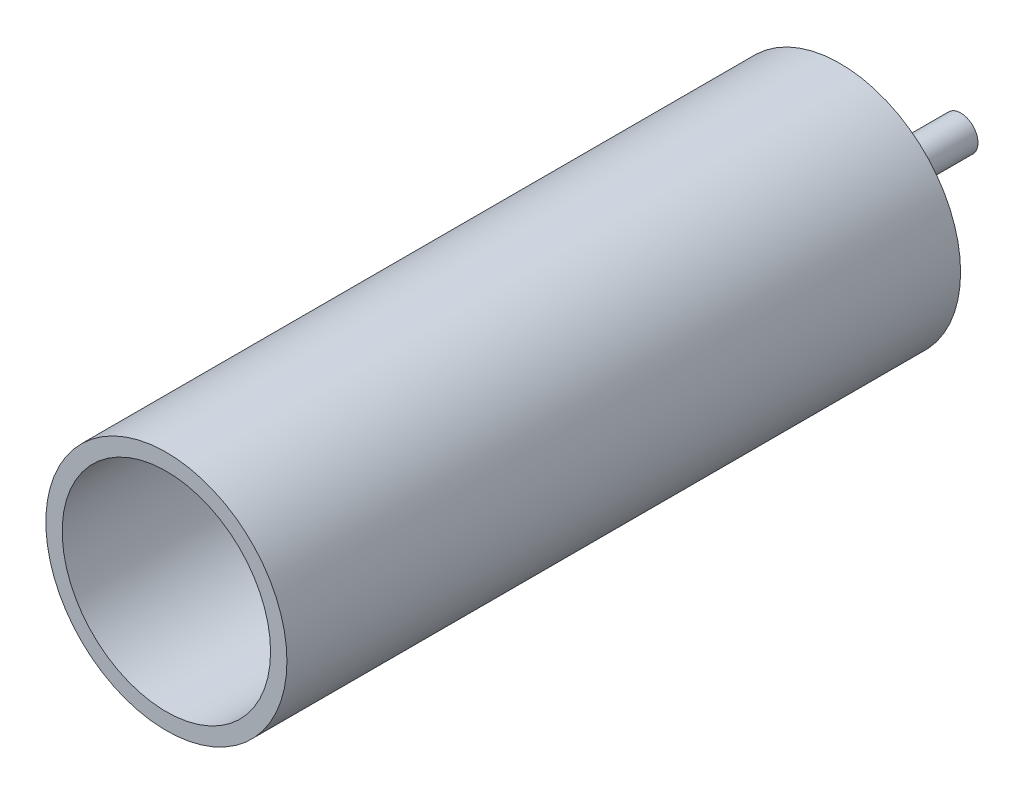
ISO-10303-21;
HEADER;
FILE_DESCRIPTION(('STEP AP214'),'2;1');
FILE_NAME('part.step','',(''),(''),'','','');
FILE_SCHEMA(('AUTOMOTIVE_DESIGN { 1 0 10303 214 1 1 1 1 }'));
ENDSEC;
DATA;
#1=APPLICATION_CONTEXT('core data for automotive mechanical design processes');
#2=APPLICATION_PROTOCOL_DEFINITION('international standard','automotive_design',2000,#1);
#3=PRODUCT_CONTEXT('',#1,'mechanical');
#4=PRODUCT('Part','Part','',(#3));
#5=PRODUCT_RELATED_PRODUCT_CATEGORY('part','',(#4));
#6=PRODUCT_DEFINITION_FORMATION('','',#4);
#7=PRODUCT_DEFINITION_CONTEXT('part definition',#1,'design');
#8=PRODUCT_DEFINITION('design','',#6,#7);
#9=PRODUCT_DEFINITION_SHAPE('','',#8);
#10=(LENGTH_UNIT() NAMED_UNIT(*) SI_UNIT(.MILLI.,.METRE.));
#11=(NAMED_UNIT(*) PLANE_ANGLE_UNIT() SI_UNIT($,.RADIAN.));
#12=(NAMED_UNIT(*) SI_UNIT($,.STERADIAN.) SOLID_ANGLE_UNIT());
#13=UNCERTAINTY_MEASURE_WITH_UNIT(LENGTH_MEASURE(1.E-05),#10,'distance_accuracy_value','');
#14=(GEOMETRIC_REPRESENTATION_CONTEXT(3) GLOBAL_UNCERTAINTY_ASSIGNED_CONTEXT((#13)) GLOBAL_UNIT_ASSIGNED_CONTEXT((#10,
#11,#12)) REPRESENTATION_CONTEXT('',''));
#15=CARTESIAN_POINT('',(0.,0.,0.));
#16=DIRECTION('',(0.,0.,1.));
#17=DIRECTION('',(1.,0.,0.));
#18=AXIS2_PLACEMENT_3D('',#15,#16,#17);
#19=CARTESIAN_POINT('',(0.,0.,-195.58));
#20=DIRECTION('',(0.,0.,1.));
#21=DIRECTION('',(1.,0.,0.));
#22=AXIS2_PLACEMENT_3D('',#19,#20,#21);
#23=CYLINDRICAL_SURFACE('',#22,35.);
#24=CARTESIAN_POINT('',(0.,0.,-195.58));
#25=DIRECTION('',(0.,0.,1.));
#26=DIRECTION('',(1.,0.,0.));
#27=AXIS2_PLACEMENT_3D('',#24,#25,#26);
#28=CIRCLE('',#27,35.);
#29=CARTESIAN_POINT('',(35.,0.,-195.58));
#30=VERTEX_POINT('',#29);
#31=EDGE_CURVE('E41',#30,#30,#28,.T.);
#32=ORIENTED_EDGE('',*,*,#31,.T.);
#33=EDGE_LOOP('',(#32));
#34=FACE_BOUND('',#33,.T.);
#35=CARTESIAN_POINT('',(0.,0.,0.));
#36=DIRECTION('',(0.,0.,1.));
#37=DIRECTION('',(1.,0.,0.));
#38=AXIS2_PLACEMENT_3D('',#35,#36,#37);
#39=CIRCLE('',#38,35.);
#40=CARTESIAN_POINT('',(35.,0.,0.));
#41=VERTEX_POINT('',#40);
#42=EDGE_CURVE('E46',#41,#41,#39,.T.);
#43=ORIENTED_EDGE('',*,*,#42,.F.);
#44=EDGE_LOOP('',(#43));
#45=FACE_BOUND('',#44,.T.);
#46=ADVANCED_FACE('F35',(#34,#45),#23,.T.);
#47=CARTESIAN_POINT('',(0.,0.,-195.58));
#48=DIRECTION('',(0.,0.,1.));
#49=DIRECTION('',(1.,0.,0.));
#50=AXIS2_PLACEMENT_3D('',#47,#48,#49);
#51=PLANE('',#50);
#52=CARTESIAN_POINT('',(0.,0.,-195.58));
#53=DIRECTION('',(0.,0.,1.));
#54=DIRECTION('',(1.,0.,0.));
#55=AXIS2_PLACEMENT_3D('',#52,#53,#54);
#56=CIRCLE('',#55,5.);
#57=CARTESIAN_POINT('',(5.,0.,-195.58));
#58=VERTEX_POINT('',#57);
#59=EDGE_CURVE('E10',#58,#58,#56,.F.);
#60=ORIENTED_EDGE('',*,*,#59,.F.);
#61=EDGE_LOOP('',(#60));
#62=FACE_BOUND('',#61,.T.);
#63=ORIENTED_EDGE('',*,*,#31,.F.);
#64=EDGE_LOOP('',(#63));
#65=FACE_BOUND('',#64,.T.);
#66=ADVANCED_FACE('F76',(#62,#65),#51,.F.);
#67=CARTESIAN_POINT('',(0.,0.,0.));
#68=DIRECTION('',(0.,0.,1.));
#69=DIRECTION('',(1.,0.,0.));
#70=AXIS2_PLACEMENT_3D('',#67,#68,#69);
#71=PLANE('',#70);
#72=CARTESIAN_POINT('',(0.,0.,0.));
#73=DIRECTION('',(0.,0.,1.));
#74=DIRECTION('',(1.,0.,0.));
#75=AXIS2_PLACEMENT_3D('',#72,#73,#74);
#76=CIRCLE('',#75,30.25);
#77=CARTESIAN_POINT('',(30.25,0.,0.));
#78=VERTEX_POINT('',#77);
#79=EDGE_CURVE('E57',#78,#78,#76,.T.);
#80=ORIENTED_EDGE('',*,*,#79,.F.);
#81=EDGE_LOOP('',(#80));
#82=FACE_BOUND('',#81,.T.);
#83=ORIENTED_EDGE('',*,*,#42,.T.);
#84=EDGE_LOOP('',(#83));
#85=FACE_BOUND('',#84,.T.);
#86=ADVANCED_FACE('F72',(#82,#85),#71,.T.);
#87=CARTESIAN_POINT('',(0.,0.,-230.632));
#88=DIRECTION('',(0.,0.,1.));
#89=DIRECTION('',(1.,0.,0.));
#90=AXIS2_PLACEMENT_3D('',#87,#88,#89);
#91=CYLINDRICAL_SURFACE('',#90,5.);
#92=CARTESIAN_POINT('',(0.,0.,-230.632));
#93=DIRECTION('',(0.,0.,-1.));
#94=DIRECTION('',(-1.,0.,0.));
#95=AXIS2_PLACEMENT_3D('',#92,#93,#94);
#96=CIRCLE('',#95,5.);
#97=CARTESIAN_POINT('',(-5.,0.,-230.632));
#98=VERTEX_POINT('',#97);
#99=EDGE_CURVE('E52',#98,#98,#96,.T.);
#100=ORIENTED_EDGE('',*,*,#99,.F.);
#101=EDGE_LOOP('',(#100));
#102=FACE_BOUND('',#101,.T.);
#103=ORIENTED_EDGE('',*,*,#59,.T.);
#104=EDGE_LOOP('',(#103));
#105=FACE_BOUND('',#104,.T.);
#106=ADVANCED_FACE('F75',(#102,#105),#91,.T.);
#107=CARTESIAN_POINT('',(0.,0.,-230.632));
#108=DIRECTION('',(0.,0.,-1.));
#109=DIRECTION('',(-1.,0.,0.));
#110=AXIS2_PLACEMENT_3D('',#107,#108,#109);
#111=PLANE('',#110);
#112=ORIENTED_EDGE('',*,*,#99,.T.);
#113=EDGE_LOOP('',(#112));
#114=FACE_BOUND('',#113,.T.);
#115=ADVANCED_FACE('F68',(#114),#111,.T.);
#116=CARTESIAN_POINT('',(0.,0.,-152.4));
#117=DIRECTION('',(0.,0.,1.));
#118=DIRECTION('',(1.,0.,0.));
#119=AXIS2_PLACEMENT_3D('',#116,#117,#118);
#120=CYLINDRICAL_SURFACE('',#119,30.25);
#121=CARTESIAN_POINT('',(0.,0.,-152.4));
#122=DIRECTION('',(0.,0.,1.));
#123=DIRECTION('',(1.,0.,0.));
#124=AXIS2_PLACEMENT_3D('',#121,#122,#123);
#125=CIRCLE('',#124,30.25);
#126=CARTESIAN_POINT('',(30.25,0.,-152.4));
#127=VERTEX_POINT('',#126);
#128=EDGE_CURVE('E56',#127,#127,#125,.T.);
#129=CARTESIAN_POINT('',(30.25,0.,-152.4));
#130=CARTESIAN_POINT('',(30.25,0.,-150.8125));
#131=CARTESIAN_POINT('',(30.25,0.,-149.225));
#132=CARTESIAN_POINT('',(30.25,0.,-146.05));
#133=CARTESIAN_POINT('',(30.25,0.,-144.4625));
#134=CARTESIAN_POINT('',(30.25,0.,-141.2875));
#135=CARTESIAN_POINT('',(30.25,0.,-139.7));
#136=CARTESIAN_POINT('',(30.25,0.,-136.525));
#137=CARTESIAN_POINT('',(30.25,0.,-134.9375));
#138=CARTESIAN_POINT('',(30.25,0.,-131.7625));
#139=CARTESIAN_POINT('',(30.25,0.,-130.175));
#140=CARTESIAN_POINT('',(30.25,0.,-127.));
#141=CARTESIAN_POINT('',(30.25,0.,-125.4125));
#142=CARTESIAN_POINT('',(30.25,0.,-122.2375));
#143=CARTESIAN_POINT('',(30.25,0.,-120.65));
#144=CARTESIAN_POINT('',(30.25,0.,-117.475));
#145=CARTESIAN_POINT('',(30.25,0.,-115.8875));
#146=CARTESIAN_POINT('',(30.25,0.,-112.7125));
#147=CARTESIAN_POINT('',(30.25,0.,-111.125));
#148=CARTESIAN_POINT('',(30.25,0.,-107.95));
#149=CARTESIAN_POINT('',(30.25,0.,-106.3625));
#150=CARTESIAN_POINT('',(30.25,0.,-103.1875));
#151=CARTESIAN_POINT('',(30.25,0.,-101.6));
#152=CARTESIAN_POINT('',(30.25,0.,-98.425));
#153=CARTESIAN_POINT('',(30.25,0.,-96.8375));
#154=CARTESIAN_POINT('',(30.25,0.,-93.6625));
#155=CARTESIAN_POINT('',(30.25,0.,-92.075));
#156=CARTESIAN_POINT('',(30.25,0.,-88.9));
#157=CARTESIAN_POINT('',(30.25,0.,-87.3125));
#158=CARTESIAN_POINT('',(30.25,0.,-84.1375));
#159=CARTESIAN_POINT('',(30.25,0.,-82.55));
#160=CARTESIAN_POINT('',(30.25,0.,-79.375));
#161=CARTESIAN_POINT('',(30.25,0.,-77.7875));
#162=CARTESIAN_POINT('',(30.25,0.,-74.6125));
#163=CARTESIAN_POINT('',(30.25,0.,-73.025));
#164=CARTESIAN_POINT('',(30.25,0.,-69.85));
#165=CARTESIAN_POINT('',(30.25,0.,-68.2625));
#166=CARTESIAN_POINT('',(30.25,0.,-65.0875));
#167=CARTESIAN_POINT('',(30.25,0.,-63.5));
#168=CARTESIAN_POINT('',(30.25,0.,-60.325));
#169=CARTESIAN_POINT('',(30.25,0.,-58.7375));
#170=CARTESIAN_POINT('',(30.25,0.,-55.5625));
#171=CARTESIAN_POINT('',(30.25,0.,-53.975));
#172=CARTESIAN_POINT('',(30.25,0.,-50.8));
#173=CARTESIAN_POINT('',(30.25,0.,-49.2125));
#174=CARTESIAN_POINT('',(30.25,0.,-46.0375));
#175=CARTESIAN_POINT('',(30.25,0.,-44.45));
#176=CARTESIAN_POINT('',(30.25,0.,-41.275));
#177=CARTESIAN_POINT('',(30.25,0.,-39.6875));
#178=CARTESIAN_POINT('',(30.25,0.,-36.5125));
#179=CARTESIAN_POINT('',(30.25,0.,-34.925));
#180=CARTESIAN_POINT('',(30.25,0.,-31.75));
#181=CARTESIAN_POINT('',(30.25,0.,-30.1625));
#182=CARTESIAN_POINT('',(30.25,0.,-26.9875));
#183=CARTESIAN_POINT('',(30.25,0.,-25.4));
#184=CARTESIAN_POINT('',(30.25,0.,-22.225));
#185=CARTESIAN_POINT('',(30.25,0.,-20.6375));
#186=CARTESIAN_POINT('',(30.25,0.,-17.4625));
#187=CARTESIAN_POINT('',(30.25,0.,-15.875));
#188=CARTESIAN_POINT('',(30.25,0.,-12.7));
#189=CARTESIAN_POINT('',(30.25,0.,-11.1125));
#190=CARTESIAN_POINT('',(30.25,0.,-7.93750000000001));
#191=CARTESIAN_POINT('',(30.25,0.,-6.35));
#192=CARTESIAN_POINT('',(30.25,0.,-3.175));
#193=CARTESIAN_POINT('',(30.25,0.,-1.5875));
#194=CARTESIAN_POINT('',(30.25,0.,0.));
#195=B_SPLINE_CURVE_WITH_KNOTS('',3,(#129,#130,#131,#132,#133,#134,#135,#136,#137,#138,#139,
#140,#141,#142,#143,#144,#145,#146,#147,#148,#149,#150,#151,#152,#153,#154,#155,#156,#157,#158,
#159,#160,#161,#162,#163,#164,#165,#166,#167,#168,#169,#170,#171,#172,#173,#174,#175,#176,#177,
#178,#179,#180,#181,#182,#183,#184,#185,#186,#187,#188,#189,#190,#191,#192,#193,#194),
.UNSPECIFIED.,.F.,.F.,(4,2,2,2,2,2,2,2,2,2,2,2,2,2,2,2,2,2,2,2,2,2,2,2,2,2,2,2,2,2,2,2,4),(0.,
4.76249999999998,9.52499999999998,14.2875,19.05,23.8125,28.575,33.3375,38.1,42.8625,47.625,
52.3875,57.15,61.9125,66.675,71.4375,76.2,80.9625,85.725,90.4875,95.25,100.0125,104.775,
109.5375,114.3,119.0625,123.825,128.5875,133.35,138.1125,142.875,147.6375,152.4),.UNSPECIFIED.);
#196=EDGE_CURVE('BSEAM65',#127,#78,#195,.T.);
#197=ORIENTED_EDGE('',*,*,#128,.F.);
#198=ORIENTED_EDGE('',*,*,#79,.T.);
#199=ORIENTED_EDGE('',*,*,#196,.T.);
#200=ORIENTED_EDGE('',*,*,#196,.F.);
#201=EDGE_LOOP('',(#197,#199,#198,#200));
#202=FACE_BOUND('',#201,.T.);
#203=ADVANCED_FACE('F65',(#202),#120,.F.);
#204=CARTESIAN_POINT('',(0.,0.,-152.4));
#205=DIRECTION('',(0.,0.,1.));
#206=DIRECTION('',(1.,0.,0.));
#207=AXIS2_PLACEMENT_3D('',#204,#205,#206);
#208=PLANE('',#207);
#209=ORIENTED_EDGE('',*,*,#128,.T.);
#210=EDGE_LOOP('',(#209));
#211=FACE_BOUND('',#210,.T.);
#212=ADVANCED_FACE('F63',(#211),#208,.T.);
#213=CLOSED_SHELL('',(#46,#66,#86,#106,#115,#203,#212));
#214=MANIFOLD_SOLID_BREP('B2',#213);
#215=ADVANCED_BREP_SHAPE_REPRESENTATION('',(#18,#214),#14);
#216=SHAPE_DEFINITION_REPRESENTATION(#9,#215);
ENDSEC;
END-ISO-10303-21;
